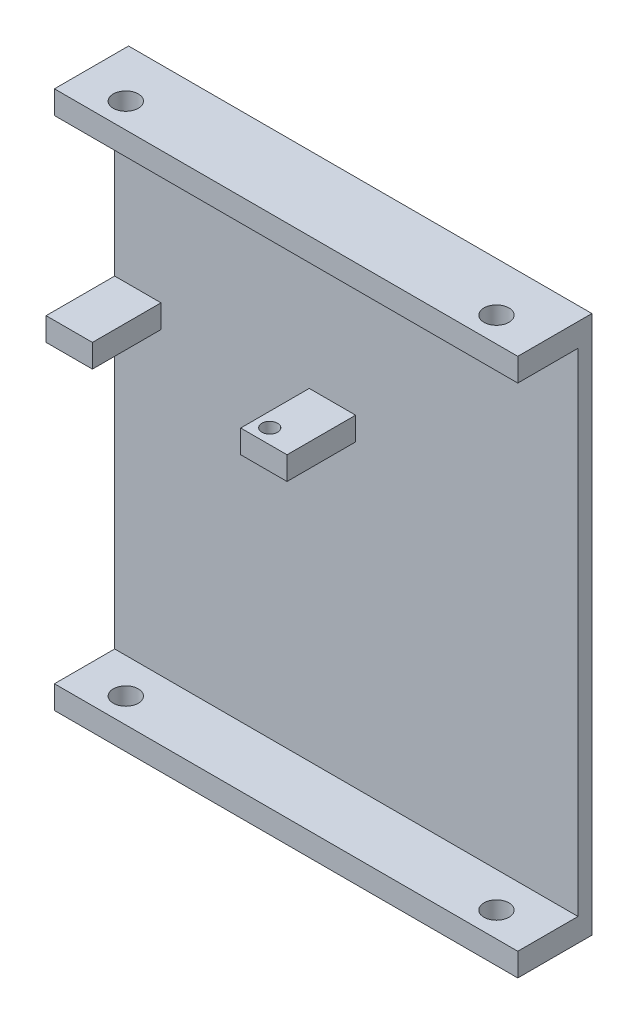
ISO-10303-21;
HEADER;
FILE_DESCRIPTION(('STEP AP214'),'2;1');
FILE_NAME('part.step','',(''),(''),'','','');
FILE_SCHEMA(('AUTOMOTIVE_DESIGN { 1 0 10303 214 1 1 1 1 }'));
ENDSEC;
DATA;
#1=APPLICATION_CONTEXT('core data for automotive mechanical design processes');
#2=APPLICATION_PROTOCOL_DEFINITION('international standard','automotive_design',2000,#1);
#3=PRODUCT_CONTEXT('',#1,'mechanical');
#4=PRODUCT('Part','Part','',(#3));
#5=PRODUCT_RELATED_PRODUCT_CATEGORY('part','',(#4));
#6=PRODUCT_DEFINITION_FORMATION('','',#4);
#7=PRODUCT_DEFINITION_CONTEXT('part definition',#1,'design');
#8=PRODUCT_DEFINITION('design','',#6,#7);
#9=PRODUCT_DEFINITION_SHAPE('','',#8);
#10=(LENGTH_UNIT() NAMED_UNIT(*) SI_UNIT(.MILLI.,.METRE.));
#11=(NAMED_UNIT(*) PLANE_ANGLE_UNIT() SI_UNIT($,.RADIAN.));
#12=(NAMED_UNIT(*) SI_UNIT($,.STERADIAN.) SOLID_ANGLE_UNIT());
#13=UNCERTAINTY_MEASURE_WITH_UNIT(LENGTH_MEASURE(1.E-05),#10,'distance_accuracy_value','');
#14=(GEOMETRIC_REPRESENTATION_CONTEXT(3) GLOBAL_UNCERTAINTY_ASSIGNED_CONTEXT((#13)) GLOBAL_UNIT_ASSIGNED_CONTEXT((#10,
#11,#12)) REPRESENTATION_CONTEXT('',''));
#15=CARTESIAN_POINT('',(0.,0.,0.));
#16=DIRECTION('',(0.,0.,1.));
#17=DIRECTION('',(1.,0.,0.));
#18=AXIS2_PLACEMENT_3D('',#15,#16,#17);
#19=CARTESIAN_POINT('',(0.,0.,3.81));
#20=DIRECTION('',(0.,0.,-1.));
#21=DIRECTION('',(-1.,0.,0.));
#22=AXIS2_PLACEMENT_3D('',#19,#20,#21);
#23=PLANE('',#22);
#24=DIRECTION('',(-1.,0.,0.));
#25=VECTOR('',#24,1.);
#26=CARTESIAN_POINT('',(0.,94.869,3.81));
#27=LINE('',#26,#25);
#28=CARTESIAN_POINT('',(12.7,94.869,3.81));
#29=VERTEX_POINT('',#28);
#30=CARTESIAN_POINT('',(0.,94.869,3.81));
#31=VERTEX_POINT('',#30);
#32=EDGE_CURVE('E199',#29,#31,#27,.T.);
#33=ORIENTED_EDGE('',*,*,#32,.F.);
#34=DIRECTION('',(0.,1.,0.));
#35=VECTOR('',#34,1.);
#36=CARTESIAN_POINT('',(12.7,88.519,3.81));
#37=LINE('',#36,#35);
#38=CARTESIAN_POINT('',(12.7,88.519,3.81));
#39=VERTEX_POINT('',#38);
#40=EDGE_CURVE('E157',#39,#29,#37,.T.);
#41=ORIENTED_EDGE('',*,*,#40,.F.);
#42=DIRECTION('',(1.,0.,0.));
#43=VECTOR('',#42,1.);
#44=CARTESIAN_POINT('',(0.,88.519,3.81));
#45=LINE('',#44,#43);
#46=CARTESIAN_POINT('',(0.,88.519,3.81));
#47=VERTEX_POINT('',#46);
#48=EDGE_CURVE('E190',#47,#39,#45,.T.);
#49=ORIENTED_EDGE('',*,*,#48,.F.);
#50=DIRECTION('',(0.,-1.,0.));
#51=VECTOR('',#50,1.);
#52=CARTESIAN_POINT('',(0.,0.,3.81));
#53=LINE('',#52,#51);
#54=CARTESIAN_POINT('',(0.,6.35,3.81));
#55=VERTEX_POINT('',#54);
#56=EDGE_CURVE('E277',#47,#55,#53,.T.);
#57=ORIENTED_EDGE('',*,*,#56,.T.);
#58=DIRECTION('',(-1.,0.,0.));
#59=VECTOR('',#58,1.);
#60=CARTESIAN_POINT('',(0.,6.35,3.81));
#61=LINE('',#60,#59);
#62=CARTESIAN_POINT('',(127.,6.35,3.81));
#63=VERTEX_POINT('',#62);
#64=EDGE_CURVE('E241',#63,#55,#61,.T.);
#65=ORIENTED_EDGE('',*,*,#64,.F.);
#66=DIRECTION('',(0.,1.,0.));
#67=VECTOR('',#66,1.);
#68=CARTESIAN_POINT('',(127.,0.,3.81));
#69=LINE('',#68,#67);
#70=CARTESIAN_POINT('',(127.,141.224,3.81));
#71=VERTEX_POINT('',#70);
#72=EDGE_CURVE('E276',#63,#71,#69,.T.);
#73=ORIENTED_EDGE('',*,*,#72,.T.);
#74=DIRECTION('',(1.,0.,0.));
#75=VECTOR('',#74,1.);
#76=CARTESIAN_POINT('',(0.,141.224,3.81));
#77=LINE('',#76,#75);
#78=CARTESIAN_POINT('',(0.,141.224,3.81));
#79=VERTEX_POINT('',#78);
#80=EDGE_CURVE('E244',#79,#71,#77,.T.);
#81=ORIENTED_EDGE('',*,*,#80,.F.);
#82=EDGE_CURVE('E274',#79,#31,#53,.T.);
#83=ORIENTED_EDGE('',*,*,#82,.T.);
#84=EDGE_LOOP('',(#33,#41,#49,#57,#65,#73,#81,#83));
#85=FACE_BOUND('',#84,.T.);
#86=DIRECTION('',(0.,-1.,0.));
#87=VECTOR('',#86,1.);
#88=CARTESIAN_POINT('',(53.34,88.519,3.81));
#89=LINE('',#88,#87);
#90=CARTESIAN_POINT('',(53.34,94.869,3.81));
#91=VERTEX_POINT('',#90);
#92=CARTESIAN_POINT('',(53.34,88.519,3.81));
#93=VERTEX_POINT('',#92);
#94=EDGE_CURVE('E151',#91,#93,#89,.T.);
#95=ORIENTED_EDGE('',*,*,#94,.F.);
#96=DIRECTION('',(-1.,0.,0.));
#97=VECTOR('',#96,1.);
#98=CARTESIAN_POINT('',(53.34,94.869,3.81));
#99=LINE('',#98,#97);
#100=CARTESIAN_POINT('',(66.04,94.869,3.81));
#101=VERTEX_POINT('',#100);
#102=EDGE_CURVE('E153',#101,#91,#99,.T.);
#103=ORIENTED_EDGE('',*,*,#102,.F.);
#104=DIRECTION('',(0.,1.,0.));
#105=VECTOR('',#104,1.);
#106=CARTESIAN_POINT('',(66.04,88.519,3.81));
#107=LINE('',#106,#105);
#108=CARTESIAN_POINT('',(66.04,88.519,3.81));
#109=VERTEX_POINT('',#108);
#110=EDGE_CURVE('E62',#109,#101,#107,.T.);
#111=ORIENTED_EDGE('',*,*,#110,.F.);
#112=DIRECTION('',(1.,0.,0.));
#113=VECTOR('',#112,1.);
#114=CARTESIAN_POINT('',(53.34,88.519,3.81));
#115=LINE('',#114,#113);
#116=EDGE_CURVE('E57',#93,#109,#115,.T.);
#117=ORIENTED_EDGE('',*,*,#116,.F.);
#118=EDGE_LOOP('',(#95,#103,#111,#117));
#119=FACE_BOUND('',#118,.T.);
#120=ADVANCED_FACE('F40',(#85,#119),#23,.F.);
#121=CARTESIAN_POINT('',(0.,0.,3.81));
#122=DIRECTION('',(1.,0.,0.));
#123=DIRECTION('',(0.,1.,0.));
#124=AXIS2_PLACEMENT_3D('',#121,#122,#123);
#125=PLANE('',#124);
#126=DIRECTION('',(0.,-1.,0.));
#127=VECTOR('',#126,1.);
#128=CARTESIAN_POINT('',(0.,0.,0.));
#129=LINE('',#128,#127);
#130=CARTESIAN_POINT('',(0.,147.574,0.));
#131=VERTEX_POINT('',#130);
#132=CARTESIAN_POINT('',(0.,0.,0.));
#133=VERTEX_POINT('',#132);
#134=EDGE_CURVE('E273',#131,#133,#129,.T.);
#135=ORIENTED_EDGE('',*,*,#134,.T.);
#136=DIRECTION('',(0.,0.,-1.));
#137=VECTOR('',#136,1.);
#138=CARTESIAN_POINT('',(0.,0.,3.81));
#139=LINE('',#138,#137);
#140=CARTESIAN_POINT('',(0.,0.,20.32));
#141=VERTEX_POINT('',#140);
#142=EDGE_CURVE('E12',#141,#133,#139,.T.);
#143=ORIENTED_EDGE('',*,*,#142,.F.);
#144=DIRECTION('',(0.,-1.,0.));
#145=VECTOR('',#144,1.);
#146=CARTESIAN_POINT('',(0.,0.,20.32));
#147=LINE('',#146,#145);
#148=CARTESIAN_POINT('',(0.,6.35,20.32));
#149=VERTEX_POINT('',#148);
#150=EDGE_CURVE('E245',#149,#141,#147,.T.);
#151=ORIENTED_EDGE('',*,*,#150,.F.);
#152=DIRECTION('',(0.,0.,-1.));
#153=VECTOR('',#152,1.);
#154=CARTESIAN_POINT('',(0.,6.35,20.32));
#155=LINE('',#154,#153);
#156=EDGE_CURVE('E237',#149,#55,#155,.T.);
#157=ORIENTED_EDGE('',*,*,#156,.T.);
#158=ORIENTED_EDGE('',*,*,#56,.F.);
#159=DIRECTION('',(0.,0.,-1.));
#160=VECTOR('',#159,1.);
#161=CARTESIAN_POINT('',(0.,88.519,22.606));
#162=LINE('',#161,#160);
#163=CARTESIAN_POINT('',(0.,88.519,22.606));
#164=VERTEX_POINT('',#163);
#165=EDGE_CURVE('E206',#164,#47,#162,.T.);
#166=ORIENTED_EDGE('',*,*,#165,.F.);
#167=DIRECTION('',(0.,-1.,0.));
#168=VECTOR('',#167,1.);
#169=CARTESIAN_POINT('',(0.,88.519,22.606));
#170=LINE('',#169,#168);
#171=CARTESIAN_POINT('',(0.,94.869,22.606));
#172=VERTEX_POINT('',#171);
#173=EDGE_CURVE('E192',#172,#164,#170,.T.);
#174=ORIENTED_EDGE('',*,*,#173,.F.);
#175=DIRECTION('',(0.,0.,-1.));
#176=VECTOR('',#175,1.);
#177=CARTESIAN_POINT('',(0.,94.869,22.606));
#178=LINE('',#177,#176);
#179=EDGE_CURVE('E209',#172,#31,#178,.T.);
#180=ORIENTED_EDGE('',*,*,#179,.T.);
#181=ORIENTED_EDGE('',*,*,#82,.F.);
#182=DIRECTION('',(0.,0.,-1.));
#183=VECTOR('',#182,1.);
#184=CARTESIAN_POINT('',(0.,141.224,20.32));
#185=LINE('',#184,#183);
#186=CARTESIAN_POINT('',(0.,141.224,20.32));
#187=VERTEX_POINT('',#186);
#188=EDGE_CURVE('E270',#187,#79,#185,.T.);
#189=ORIENTED_EDGE('',*,*,#188,.F.);
#190=DIRECTION('',(0.,-1.,0.));
#191=VECTOR('',#190,1.);
#192=CARTESIAN_POINT('',(0.,147.574,20.32));
#193=LINE('',#192,#191);
#194=CARTESIAN_POINT('',(0.,147.574,20.32));
#195=VERTEX_POINT('',#194);
#196=EDGE_CURVE('E254',#195,#187,#193,.T.);
#197=ORIENTED_EDGE('',*,*,#196,.F.);
#198=DIRECTION('',(0.,0.,-1.));
#199=VECTOR('',#198,1.);
#200=CARTESIAN_POINT('',(0.,147.574,3.81));
#201=LINE('',#200,#199);
#202=EDGE_CURVE('E279',#195,#131,#201,.T.);
#203=ORIENTED_EDGE('',*,*,#202,.T.);
#204=EDGE_LOOP('',(#135,#143,#151,#157,#158,#166,#174,#180,#181,#189,#197,#203));
#205=FACE_BOUND('',#204,.T.);
#206=ADVANCED_FACE('F42',(#205),#125,.F.);
#207=CARTESIAN_POINT('',(0.,0.,3.81));
#208=DIRECTION('',(0.,1.,0.));
#209=DIRECTION('',(0.,0.,1.));
#210=AXIS2_PLACEMENT_3D('',#207,#208,#209);
#211=PLANE('',#210);
#212=CARTESIAN_POINT('',(12.7,0.,13.462));
#213=DIRECTION('',(0.,-1.,0.));
#214=DIRECTION('',(0.,0.,-1.));
#215=AXIS2_PLACEMENT_3D('',#212,#213,#214);
#216=CIRCLE('',#215,3.429);
#217=CARTESIAN_POINT('',(12.7,0.,10.033));
#218=VERTEX_POINT('',#217);
#219=EDGE_CURVE('E220',#218,#218,#216,.T.);
#220=ORIENTED_EDGE('',*,*,#219,.F.);
#221=EDGE_LOOP('',(#220));
#222=FACE_BOUND('',#221,.T.);
#223=CARTESIAN_POINT('',(114.3,0.,13.462));
#224=DIRECTION('',(0.,-1.,0.));
#225=DIRECTION('',(0.,0.,-1.));
#226=AXIS2_PLACEMENT_3D('',#223,#224,#225);
#227=CIRCLE('',#226,3.429);
#228=CARTESIAN_POINT('',(114.3,0.,10.033));
#229=VERTEX_POINT('',#228);
#230=EDGE_CURVE('E223',#229,#229,#227,.T.);
#231=ORIENTED_EDGE('',*,*,#230,.F.);
#232=EDGE_LOOP('',(#231));
#233=FACE_BOUND('',#232,.T.);
#234=DIRECTION('',(1.,0.,0.));
#235=VECTOR('',#234,1.);
#236=CARTESIAN_POINT('',(0.,0.,0.));
#237=LINE('',#236,#235);
#238=CARTESIAN_POINT('',(127.,0.,0.));
#239=VERTEX_POINT('',#238);
#240=EDGE_CURVE('E282',#133,#239,#237,.T.);
#241=ORIENTED_EDGE('',*,*,#240,.T.);
#242=DIRECTION('',(0.,0.,-1.));
#243=VECTOR('',#242,1.);
#244=CARTESIAN_POINT('',(127.,0.,3.81));
#245=LINE('',#244,#243);
#246=CARTESIAN_POINT('',(127.,0.,20.32));
#247=VERTEX_POINT('',#246);
#248=EDGE_CURVE('E49',#247,#239,#245,.T.);
#249=ORIENTED_EDGE('',*,*,#248,.F.);
#250=DIRECTION('',(1.,0.,0.));
#251=VECTOR('',#250,1.);
#252=CARTESIAN_POINT('',(0.,0.,20.32));
#253=LINE('',#252,#251);
#254=EDGE_CURVE('E249',#141,#247,#253,.T.);
#255=ORIENTED_EDGE('',*,*,#254,.F.);
#256=ORIENTED_EDGE('',*,*,#142,.T.);
#257=EDGE_LOOP('',(#241,#249,#255,#256));
#258=FACE_BOUND('',#257,.T.);
#259=ADVANCED_FACE('F327',(#222,#233,#258),#211,.F.);
#260=CARTESIAN_POINT('',(127.,0.,3.81));
#261=DIRECTION('',(-1.,0.,0.));
#262=DIRECTION('',(0.,-1.,0.));
#263=AXIS2_PLACEMENT_3D('',#260,#261,#262);
#264=PLANE('',#263);
#265=DIRECTION('',(0.,1.,0.));
#266=VECTOR('',#265,1.);
#267=CARTESIAN_POINT('',(127.,0.,0.));
#268=LINE('',#267,#266);
#269=CARTESIAN_POINT('',(127.,147.574,0.));
#270=VERTEX_POINT('',#269);
#271=EDGE_CURVE('E284',#239,#270,#268,.T.);
#272=ORIENTED_EDGE('',*,*,#271,.T.);
#273=DIRECTION('',(0.,0.,-1.));
#274=VECTOR('',#273,1.);
#275=CARTESIAN_POINT('',(127.,147.574,3.81));
#276=LINE('',#275,#274);
#277=CARTESIAN_POINT('',(127.,147.574,20.32));
#278=VERTEX_POINT('',#277);
#279=EDGE_CURVE('E290',#278,#270,#276,.T.);
#280=ORIENTED_EDGE('',*,*,#279,.F.);
#281=DIRECTION('',(0.,1.,0.));
#282=VECTOR('',#281,1.);
#283=CARTESIAN_POINT('',(127.,147.574,20.32));
#284=LINE('',#283,#282);
#285=CARTESIAN_POINT('',(127.,141.224,20.32));
#286=VERTEX_POINT('',#285);
#287=EDGE_CURVE('E259',#286,#278,#284,.T.);
#288=ORIENTED_EDGE('',*,*,#287,.F.);
#289=DIRECTION('',(0.,0.,-1.));
#290=VECTOR('',#289,1.);
#291=CARTESIAN_POINT('',(127.,141.224,20.32));
#292=LINE('',#291,#290);
#293=EDGE_CURVE('E265',#286,#71,#292,.T.);
#294=ORIENTED_EDGE('',*,*,#293,.T.);
#295=ORIENTED_EDGE('',*,*,#72,.F.);
#296=DIRECTION('',(0.,0.,-1.));
#297=VECTOR('',#296,1.);
#298=CARTESIAN_POINT('',(127.,6.35,20.32));
#299=LINE('',#298,#297);
#300=CARTESIAN_POINT('',(127.,6.35,20.32));
#301=VERTEX_POINT('',#300);
#302=EDGE_CURVE('E234',#301,#63,#299,.T.);
#303=ORIENTED_EDGE('',*,*,#302,.F.);
#304=DIRECTION('',(0.,1.,0.));
#305=VECTOR('',#304,1.);
#306=CARTESIAN_POINT('',(127.,0.,20.32));
#307=LINE('',#306,#305);
#308=EDGE_CURVE('E247',#247,#301,#307,.T.);
#309=ORIENTED_EDGE('',*,*,#308,.F.);
#310=ORIENTED_EDGE('',*,*,#248,.T.);
#311=EDGE_LOOP('',(#272,#280,#288,#294,#295,#303,#309,#310));
#312=FACE_BOUND('',#311,.T.);
#313=ADVANCED_FACE('F340',(#312),#264,.F.);
#314=CARTESIAN_POINT('',(0.,147.574,3.81));
#315=DIRECTION('',(0.,-1.,0.));
#316=DIRECTION('',(0.,0.,-1.));
#317=AXIS2_PLACEMENT_3D('',#314,#315,#316);
#318=PLANE('',#317);
#319=CARTESIAN_POINT('',(12.7,147.574,13.462));
#320=DIRECTION('',(0.,-1.,0.));
#321=DIRECTION('',(0.,0.,-1.));
#322=AXIS2_PLACEMENT_3D('',#319,#320,#321);
#323=CIRCLE('',#322,3.429);
#324=CARTESIAN_POINT('',(12.7,147.574,10.033));
#325=VERTEX_POINT('',#324);
#326=EDGE_CURVE('E216',#325,#325,#323,.T.);
#327=ORIENTED_EDGE('',*,*,#326,.T.);
#328=EDGE_LOOP('',(#327));
#329=FACE_BOUND('',#328,.T.);
#330=CARTESIAN_POINT('',(114.3,147.574,13.462));
#331=DIRECTION('',(0.,-1.,0.));
#332=DIRECTION('',(0.,0.,-1.));
#333=AXIS2_PLACEMENT_3D('',#330,#331,#332);
#334=CIRCLE('',#333,3.429);
#335=CARTESIAN_POINT('',(114.3,147.574,10.033));
#336=VERTEX_POINT('',#335);
#337=EDGE_CURVE('E215',#336,#336,#334,.T.);
#338=ORIENTED_EDGE('',*,*,#337,.T.);
#339=EDGE_LOOP('',(#338));
#340=FACE_BOUND('',#339,.T.);
#341=DIRECTION('',(-1.,0.,0.));
#342=VECTOR('',#341,1.);
#343=CARTESIAN_POINT('',(0.,147.574,0.));
#344=LINE('',#343,#342);
#345=EDGE_CURVE('E286',#270,#131,#344,.T.);
#346=ORIENTED_EDGE('',*,*,#345,.T.);
#347=ORIENTED_EDGE('',*,*,#202,.F.);
#348=DIRECTION('',(-1.,0.,0.));
#349=VECTOR('',#348,1.);
#350=CARTESIAN_POINT('',(0.,147.574,20.32));
#351=LINE('',#350,#349);
#352=EDGE_CURVE('E262',#278,#195,#351,.T.);
#353=ORIENTED_EDGE('',*,*,#352,.F.);
#354=ORIENTED_EDGE('',*,*,#279,.T.);
#355=EDGE_LOOP('',(#346,#347,#353,#354));
#356=FACE_BOUND('',#355,.T.);
#357=ADVANCED_FACE('F336',(#329,#340,#356),#318,.F.);
#358=CARTESIAN_POINT('',(0.,0.,0.));
#359=DIRECTION('',(0.,0.,-1.));
#360=DIRECTION('',(-1.,0.,0.));
#361=AXIS2_PLACEMENT_3D('',#358,#359,#360);
#362=PLANE('',#361);
#363=ORIENTED_EDGE('',*,*,#134,.F.);
#364=ORIENTED_EDGE('',*,*,#345,.F.);
#365=ORIENTED_EDGE('',*,*,#271,.F.);
#366=ORIENTED_EDGE('',*,*,#240,.F.);
#367=EDGE_LOOP('',(#363,#364,#365,#366));
#368=FACE_BOUND('',#367,.T.);
#369=ADVANCED_FACE('F333',(#368),#362,.T.);
#370=CARTESIAN_POINT('',(0.,141.224,20.32));
#371=DIRECTION('',(0.,1.,0.));
#372=DIRECTION('',(0.,0.,1.));
#373=AXIS2_PLACEMENT_3D('',#370,#371,#372);
#374=PLANE('',#373);
#375=CARTESIAN_POINT('',(12.7,141.224,13.462));
#376=DIRECTION('',(0.,1.,0.));
#377=DIRECTION('',(0.,0.,1.));
#378=AXIS2_PLACEMENT_3D('',#375,#376,#377);
#379=CIRCLE('',#378,3.429);
#380=CARTESIAN_POINT('',(12.7,141.224,16.891));
#381=VERTEX_POINT('',#380);
#382=EDGE_CURVE('E231',#381,#381,#379,.T.);
#383=ORIENTED_EDGE('',*,*,#382,.T.);
#384=EDGE_LOOP('',(#383));
#385=FACE_BOUND('',#384,.T.);
#386=CARTESIAN_POINT('',(114.3,141.224,13.462));
#387=DIRECTION('',(0.,1.,0.));
#388=DIRECTION('',(0.,0.,1.));
#389=AXIS2_PLACEMENT_3D('',#386,#387,#388);
#390=CIRCLE('',#389,3.429);
#391=CARTESIAN_POINT('',(114.3,141.224,16.891));
#392=VERTEX_POINT('',#391);
#393=EDGE_CURVE('E228',#392,#392,#390,.T.);
#394=ORIENTED_EDGE('',*,*,#393,.T.);
#395=EDGE_LOOP('',(#394));
#396=FACE_BOUND('',#395,.T.);
#397=ORIENTED_EDGE('',*,*,#80,.T.);
#398=ORIENTED_EDGE('',*,*,#293,.F.);
#399=DIRECTION('',(1.,0.,0.));
#400=VECTOR('',#399,1.);
#401=CARTESIAN_POINT('',(0.,141.224,20.32));
#402=LINE('',#401,#400);
#403=EDGE_CURVE('E257',#187,#286,#402,.T.);
#404=ORIENTED_EDGE('',*,*,#403,.F.);
#405=ORIENTED_EDGE('',*,*,#188,.T.);
#406=EDGE_LOOP('',(#397,#398,#404,#405));
#407=FACE_BOUND('',#406,.T.);
#408=ADVANCED_FACE('F331',(#385,#396,#407),#374,.F.);
#409=CARTESIAN_POINT('',(0.,0.,20.32));
#410=DIRECTION('',(0.,0.,1.));
#411=DIRECTION('',(1.,0.,0.));
#412=AXIS2_PLACEMENT_3D('',#409,#410,#411);
#413=PLANE('',#412);
#414=ORIENTED_EDGE('',*,*,#196,.T.);
#415=ORIENTED_EDGE('',*,*,#403,.T.);
#416=ORIENTED_EDGE('',*,*,#287,.T.);
#417=ORIENTED_EDGE('',*,*,#352,.T.);
#418=EDGE_LOOP('',(#414,#415,#416,#417));
#419=FACE_BOUND('',#418,.T.);
#420=ADVANCED_FACE('F364',(#419),#413,.T.);
#421=CARTESIAN_POINT('',(0.,6.35,20.32));
#422=DIRECTION('',(0.,-1.,0.));
#423=DIRECTION('',(0.,0.,-1.));
#424=AXIS2_PLACEMENT_3D('',#421,#422,#423);
#425=PLANE('',#424);
#426=CARTESIAN_POINT('',(12.7,6.34999999999999,13.462));
#427=DIRECTION('',(0.,-1.,0.));
#428=DIRECTION('',(0.,0.,-1.));
#429=AXIS2_PLACEMENT_3D('',#426,#427,#428);
#430=CIRCLE('',#429,3.429);
#431=CARTESIAN_POINT('',(12.7,6.34999999999999,10.033));
#432=VERTEX_POINT('',#431);
#433=EDGE_CURVE('E44',#432,#432,#430,.T.);
#434=ORIENTED_EDGE('',*,*,#433,.T.);
#435=EDGE_LOOP('',(#434));
#436=FACE_BOUND('',#435,.T.);
#437=CARTESIAN_POINT('',(114.3,6.34999999999999,13.462));
#438=DIRECTION('',(0.,-1.,0.));
#439=DIRECTION('',(0.,0.,-1.));
#440=AXIS2_PLACEMENT_3D('',#437,#438,#439);
#441=CIRCLE('',#440,3.429);
#442=CARTESIAN_POINT('',(114.3,6.34999999999999,10.033));
#443=VERTEX_POINT('',#442);
#444=EDGE_CURVE('E219',#443,#443,#441,.T.);
#445=ORIENTED_EDGE('',*,*,#444,.T.);
#446=EDGE_LOOP('',(#445));
#447=FACE_BOUND('',#446,.T.);
#448=ORIENTED_EDGE('',*,*,#64,.T.);
#449=ORIENTED_EDGE('',*,*,#156,.F.);
#450=DIRECTION('',(-1.,0.,0.));
#451=VECTOR('',#450,1.);
#452=CARTESIAN_POINT('',(0.,6.35,20.32));
#453=LINE('',#452,#451);
#454=EDGE_CURVE('E240',#301,#149,#453,.T.);
#455=ORIENTED_EDGE('',*,*,#454,.F.);
#456=ORIENTED_EDGE('',*,*,#302,.T.);
#457=EDGE_LOOP('',(#448,#449,#455,#456));
#458=FACE_BOUND('',#457,.T.);
#459=ADVANCED_FACE('F297',(#436,#447,#458),#425,.F.);
#460=CARTESIAN_POINT('',(0.,0.,20.32));
#461=DIRECTION('',(0.,0.,-1.));
#462=DIRECTION('',(-1.,0.,0.));
#463=AXIS2_PLACEMENT_3D('',#460,#461,#462);
#464=PLANE('',#463);
#465=ORIENTED_EDGE('',*,*,#150,.T.);
#466=ORIENTED_EDGE('',*,*,#254,.T.);
#467=ORIENTED_EDGE('',*,*,#308,.T.);
#468=ORIENTED_EDGE('',*,*,#454,.T.);
#469=EDGE_LOOP('',(#465,#466,#467,#468));
#470=FACE_BOUND('',#469,.T.);
#471=ADVANCED_FACE('F303',(#470),#464,.F.);
#472=CARTESIAN_POINT('',(114.3,147.574,13.462));
#473=DIRECTION('',(0.,-1.,0.));
#474=DIRECTION('',(0.,0.,-1.));
#475=AXIS2_PLACEMENT_3D('',#472,#473,#474);
#476=CYLINDRICAL_SURFACE('',#475,3.429);
#477=ORIENTED_EDGE('',*,*,#230,.T.);
#478=EDGE_LOOP('',(#477));
#479=FACE_BOUND('',#478,.T.);
#480=ORIENTED_EDGE('',*,*,#444,.F.);
#481=EDGE_LOOP('',(#480));
#482=FACE_BOUND('',#481,.T.);
#483=ADVANCED_FACE('F300',(#479,#482),#476,.F.);
#484=CARTESIAN_POINT('',(12.7,147.574,13.462));
#485=DIRECTION('',(0.,-1.,0.));
#486=DIRECTION('',(0.,0.,-1.));
#487=AXIS2_PLACEMENT_3D('',#484,#485,#486);
#488=CYLINDRICAL_SURFACE('',#487,3.429);
#489=ORIENTED_EDGE('',*,*,#219,.T.);
#490=EDGE_LOOP('',(#489));
#491=FACE_BOUND('',#490,.T.);
#492=ORIENTED_EDGE('',*,*,#433,.F.);
#493=EDGE_LOOP('',(#492));
#494=FACE_BOUND('',#493,.T.);
#495=ADVANCED_FACE('F302',(#491,#494),#488,.F.);
#496=ORIENTED_EDGE('',*,*,#337,.F.);
#497=EDGE_LOOP('',(#496));
#498=FACE_BOUND('',#497,.T.);
#499=ORIENTED_EDGE('',*,*,#393,.F.);
#500=EDGE_LOOP('',(#499));
#501=FACE_BOUND('',#500,.T.);
#502=ADVANCED_FACE('F306',(#498,#501),#476,.F.);
#503=ORIENTED_EDGE('',*,*,#326,.F.);
#504=EDGE_LOOP('',(#503));
#505=FACE_BOUND('',#504,.T.);
#506=ORIENTED_EDGE('',*,*,#382,.F.);
#507=EDGE_LOOP('',(#506));
#508=FACE_BOUND('',#507,.T.);
#509=ADVANCED_FACE('F313',(#505,#508),#488,.F.);
#510=CARTESIAN_POINT('',(12.7,88.519,22.606));
#511=DIRECTION('',(-1.,0.,0.));
#512=DIRECTION('',(0.,0.,1.));
#513=AXIS2_PLACEMENT_3D('',#510,#511,#512);
#514=PLANE('',#513);
#515=ORIENTED_EDGE('',*,*,#40,.T.);
#516=DIRECTION('',(0.,0.,-1.));
#517=VECTOR('',#516,1.);
#518=CARTESIAN_POINT('',(12.7,94.869,22.606));
#519=LINE('',#518,#517);
#520=CARTESIAN_POINT('',(12.7,94.869,22.606));
#521=VERTEX_POINT('',#520);
#522=EDGE_CURVE('E212',#521,#29,#519,.T.);
#523=ORIENTED_EDGE('',*,*,#522,.F.);
#524=DIRECTION('',(0.,1.,0.));
#525=VECTOR('',#524,1.);
#526=CARTESIAN_POINT('',(12.7,88.519,22.606));
#527=LINE('',#526,#525);
#528=CARTESIAN_POINT('',(12.7,88.519,22.606));
#529=VERTEX_POINT('',#528);
#530=EDGE_CURVE('E186',#529,#521,#527,.T.);
#531=ORIENTED_EDGE('',*,*,#530,.F.);
#532=DIRECTION('',(0.,0.,-1.));
#533=VECTOR('',#532,1.);
#534=CARTESIAN_POINT('',(12.7,88.519,22.606));
#535=LINE('',#534,#533);
#536=EDGE_CURVE('E196',#529,#39,#535,.T.);
#537=ORIENTED_EDGE('',*,*,#536,.T.);
#538=EDGE_LOOP('',(#515,#523,#531,#537));
#539=FACE_BOUND('',#538,.T.);
#540=ADVANCED_FACE('F382',(#539),#514,.F.);
#541=CARTESIAN_POINT('',(0.,94.869,22.606));
#542=DIRECTION('',(0.,-1.,0.));
#543=DIRECTION('',(0.,0.,-1.));
#544=AXIS2_PLACEMENT_3D('',#541,#542,#543);
#545=PLANE('',#544);
#546=ORIENTED_EDGE('',*,*,#32,.T.);
#547=ORIENTED_EDGE('',*,*,#179,.F.);
#548=DIRECTION('',(-1.,0.,0.));
#549=VECTOR('',#548,1.);
#550=CARTESIAN_POINT('',(0.,94.869,22.606));
#551=LINE('',#550,#549);
#552=EDGE_CURVE('E189',#521,#172,#551,.T.);
#553=ORIENTED_EDGE('',*,*,#552,.F.);
#554=ORIENTED_EDGE('',*,*,#522,.T.);
#555=EDGE_LOOP('',(#546,#547,#553,#554));
#556=FACE_BOUND('',#555,.T.);
#557=ADVANCED_FACE('F373',(#556),#545,.F.);
#558=CARTESIAN_POINT('',(0.,88.519,22.606));
#559=DIRECTION('',(0.,1.,0.));
#560=DIRECTION('',(0.,0.,1.));
#561=AXIS2_PLACEMENT_3D('',#558,#559,#560);
#562=PLANE('',#561);
#563=ORIENTED_EDGE('',*,*,#48,.T.);
#564=ORIENTED_EDGE('',*,*,#536,.F.);
#565=DIRECTION('',(1.,0.,0.));
#566=VECTOR('',#565,1.);
#567=CARTESIAN_POINT('',(0.,88.519,22.606));
#568=LINE('',#567,#566);
#569=EDGE_CURVE('E194',#164,#529,#568,.T.);
#570=ORIENTED_EDGE('',*,*,#569,.F.);
#571=ORIENTED_EDGE('',*,*,#165,.T.);
#572=EDGE_LOOP('',(#563,#564,#570,#571));
#573=FACE_BOUND('',#572,.T.);
#574=ADVANCED_FACE('F379',(#573),#562,.F.);
#575=CARTESIAN_POINT('',(0.,0.,22.606));
#576=DIRECTION('',(0.,0.,-1.));
#577=DIRECTION('',(-1.,0.,0.));
#578=AXIS2_PLACEMENT_3D('',#575,#576,#577);
#579=PLANE('',#578);
#580=ORIENTED_EDGE('',*,*,#530,.T.);
#581=ORIENTED_EDGE('',*,*,#552,.T.);
#582=ORIENTED_EDGE('',*,*,#173,.T.);
#583=ORIENTED_EDGE('',*,*,#569,.T.);
#584=EDGE_LOOP('',(#580,#581,#582,#583));
#585=FACE_BOUND('',#584,.T.);
#586=ADVANCED_FACE('F384',(#585),#579,.F.);
#587=CARTESIAN_POINT('',(53.34,88.519,22.606));
#588=DIRECTION('',(1.,0.,0.));
#589=DIRECTION('',(0.,0.,-1.));
#590=AXIS2_PLACEMENT_3D('',#587,#588,#589);
#591=PLANE('',#590);
#592=ORIENTED_EDGE('',*,*,#94,.T.);
#593=DIRECTION('',(0.,0.,-1.));
#594=VECTOR('',#593,1.);
#595=CARTESIAN_POINT('',(53.34,88.519,22.606));
#596=LINE('',#595,#594);
#597=CARTESIAN_POINT('',(53.34,88.519,22.606));
#598=VERTEX_POINT('',#597);
#599=EDGE_CURVE('E449',#598,#93,#596,.T.);
#600=ORIENTED_EDGE('',*,*,#599,.F.);
#601=DIRECTION('',(0.,-1.,0.));
#602=VECTOR('',#601,1.);
#603=CARTESIAN_POINT('',(53.34,88.519,22.606));
#604=LINE('',#603,#602);
#605=CARTESIAN_POINT('',(53.34,94.869,22.606));
#606=VERTEX_POINT('',#605);
#607=EDGE_CURVE('E168',#606,#598,#604,.T.);
#608=ORIENTED_EDGE('',*,*,#607,.F.);
#609=DIRECTION('',(0.,0.,-1.));
#610=VECTOR('',#609,1.);
#611=CARTESIAN_POINT('',(53.34,94.869,22.606));
#612=LINE('',#611,#610);
#613=EDGE_CURVE('E164',#606,#91,#612,.T.);
#614=ORIENTED_EDGE('',*,*,#613,.T.);
#615=EDGE_LOOP('',(#592,#600,#608,#614));
#616=FACE_BOUND('',#615,.T.);
#617=ADVANCED_FACE('F170',(#616),#591,.F.);
#618=CARTESIAN_POINT('',(53.34,88.519,22.606));
#619=DIRECTION('',(0.,1.,0.));
#620=DIRECTION('',(0.,0.,1.));
#621=AXIS2_PLACEMENT_3D('',#618,#619,#620);
#622=PLANE('',#621);
#623=CARTESIAN_POINT('',(57.2474375810233,88.519,18.5599999999999));
#624=DIRECTION('',(0.,-1.,0.));
#625=DIRECTION('',(0.,0.,-1.));
#626=AXIS2_PLACEMENT_3D('',#623,#624,#625);
#627=CIRCLE('',#626,2.15000000000001);
#628=CARTESIAN_POINT('',(57.2474375810233,88.519,16.4099999999999));
#629=VERTEX_POINT('',#628);
#630=EDGE_CURVE('E447',#629,#629,#627,.T.);
#631=ORIENTED_EDGE('',*,*,#630,.F.);
#632=EDGE_LOOP('',(#631));
#633=FACE_BOUND('',#632,.T.);
#634=ORIENTED_EDGE('',*,*,#116,.T.);
#635=DIRECTION('',(0.,0.,-1.));
#636=VECTOR('',#635,1.);
#637=CARTESIAN_POINT('',(66.04,88.519,22.606));
#638=LINE('',#637,#636);
#639=CARTESIAN_POINT('',(66.04,88.519,22.606));
#640=VERTEX_POINT('',#639);
#641=EDGE_CURVE('E176',#640,#109,#638,.T.);
#642=ORIENTED_EDGE('',*,*,#641,.F.);
#643=DIRECTION('',(1.,0.,0.));
#644=VECTOR('',#643,1.);
#645=CARTESIAN_POINT('',(53.34,88.519,22.606));
#646=LINE('',#645,#644);
#647=EDGE_CURVE('E183',#598,#640,#646,.T.);
#648=ORIENTED_EDGE('',*,*,#647,.F.);
#649=ORIENTED_EDGE('',*,*,#599,.T.);
#650=EDGE_LOOP('',(#634,#642,#648,#649));
#651=FACE_BOUND('',#650,.T.);
#652=ADVANCED_FACE('F430',(#633,#651),#622,.F.);
#653=CARTESIAN_POINT('',(66.04,88.519,22.606));
#654=DIRECTION('',(-1.,0.,0.));
#655=DIRECTION('',(0.,0.,1.));
#656=AXIS2_PLACEMENT_3D('',#653,#654,#655);
#657=PLANE('',#656);
#658=ORIENTED_EDGE('',*,*,#110,.T.);
#659=DIRECTION('',(0.,0.,-1.));
#660=VECTOR('',#659,1.);
#661=CARTESIAN_POINT('',(66.04,94.869,22.606));
#662=LINE('',#661,#660);
#663=CARTESIAN_POINT('',(66.04,94.869,22.606));
#664=VERTEX_POINT('',#663);
#665=EDGE_CURVE('E167',#664,#101,#662,.T.);
#666=ORIENTED_EDGE('',*,*,#665,.F.);
#667=DIRECTION('',(0.,1.,0.));
#668=VECTOR('',#667,1.);
#669=CARTESIAN_POINT('',(66.04,88.519,22.606));
#670=LINE('',#669,#668);
#671=EDGE_CURVE('E174',#640,#664,#670,.T.);
#672=ORIENTED_EDGE('',*,*,#671,.F.);
#673=ORIENTED_EDGE('',*,*,#641,.T.);
#674=EDGE_LOOP('',(#658,#666,#672,#673));
#675=FACE_BOUND('',#674,.T.);
#676=ADVANCED_FACE('F426',(#675),#657,.F.);
#677=CARTESIAN_POINT('',(53.34,94.869,22.606));
#678=DIRECTION('',(0.,-1.,0.));
#679=DIRECTION('',(0.,0.,-1.));
#680=AXIS2_PLACEMENT_3D('',#677,#678,#679);
#681=PLANE('',#680);
#682=CARTESIAN_POINT('',(57.2474375810233,94.869,18.5599999999999));
#683=DIRECTION('',(0.,-1.,0.));
#684=DIRECTION('',(0.,0.,-1.));
#685=AXIS2_PLACEMENT_3D('',#682,#683,#684);
#686=CIRCLE('',#685,2.15000000000001);
#687=CARTESIAN_POINT('',(57.2474375810233,94.869,16.4099999999999));
#688=VERTEX_POINT('',#687);
#689=EDGE_CURVE('E444',#688,#688,#686,.F.);
#690=ORIENTED_EDGE('',*,*,#689,.F.);
#691=EDGE_LOOP('',(#690));
#692=FACE_BOUND('',#691,.T.);
#693=ORIENTED_EDGE('',*,*,#102,.T.);
#694=ORIENTED_EDGE('',*,*,#613,.F.);
#695=DIRECTION('',(-1.,0.,0.));
#696=VECTOR('',#695,1.);
#697=CARTESIAN_POINT('',(53.34,94.869,22.606));
#698=LINE('',#697,#696);
#699=EDGE_CURVE('E172',#664,#606,#698,.T.);
#700=ORIENTED_EDGE('',*,*,#699,.F.);
#701=ORIENTED_EDGE('',*,*,#665,.T.);
#702=EDGE_LOOP('',(#693,#694,#700,#701));
#703=FACE_BOUND('',#702,.T.);
#704=ADVANCED_FACE('F162',(#692,#703),#681,.F.);
#705=CARTESIAN_POINT('',(0.,0.,22.606));
#706=DIRECTION('',(0.,0.,-1.));
#707=DIRECTION('',(-1.,0.,0.));
#708=AXIS2_PLACEMENT_3D('',#705,#706,#707);
#709=PLANE('',#708);
#710=ORIENTED_EDGE('',*,*,#607,.T.);
#711=ORIENTED_EDGE('',*,*,#647,.T.);
#712=ORIENTED_EDGE('',*,*,#671,.T.);
#713=ORIENTED_EDGE('',*,*,#699,.T.);
#714=EDGE_LOOP('',(#710,#711,#712,#713));
#715=FACE_BOUND('',#714,.T.);
#716=ADVANCED_FACE('F419',(#715),#709,.F.);
#717=CARTESIAN_POINT('',(57.2474375810233,100.950118318204,18.5599999999999));
#718=DIRECTION('',(0.,-1.,0.));
#719=DIRECTION('',(0.,0.,-1.));
#720=AXIS2_PLACEMENT_3D('',#717,#718,#719);
#721=CYLINDRICAL_SURFACE('',#720,2.15000000000001);
#722=ORIENTED_EDGE('',*,*,#689,.T.);
#723=EDGE_LOOP('',(#722));
#724=FACE_BOUND('',#723,.T.);
#725=ORIENTED_EDGE('',*,*,#630,.T.);
#726=EDGE_LOOP('',(#725));
#727=FACE_BOUND('',#726,.T.);
#728=ADVANCED_FACE('F422',(#724,#727),#721,.F.);
#729=CLOSED_SHELL('',(#120,#206,#259,#313,#357,#369,#408,#420,#459,#471,#483,#495,#502,#509,
#540,#557,#574,#586,#617,#652,#676,#704,#716,#728));
#730=MANIFOLD_SOLID_BREP('B2',#729);
#731=ADVANCED_BREP_SHAPE_REPRESENTATION('',(#18,#730),#14);
#732=SHAPE_DEFINITION_REPRESENTATION(#9,#731);
ENDSEC;
END-ISO-10303-21;
